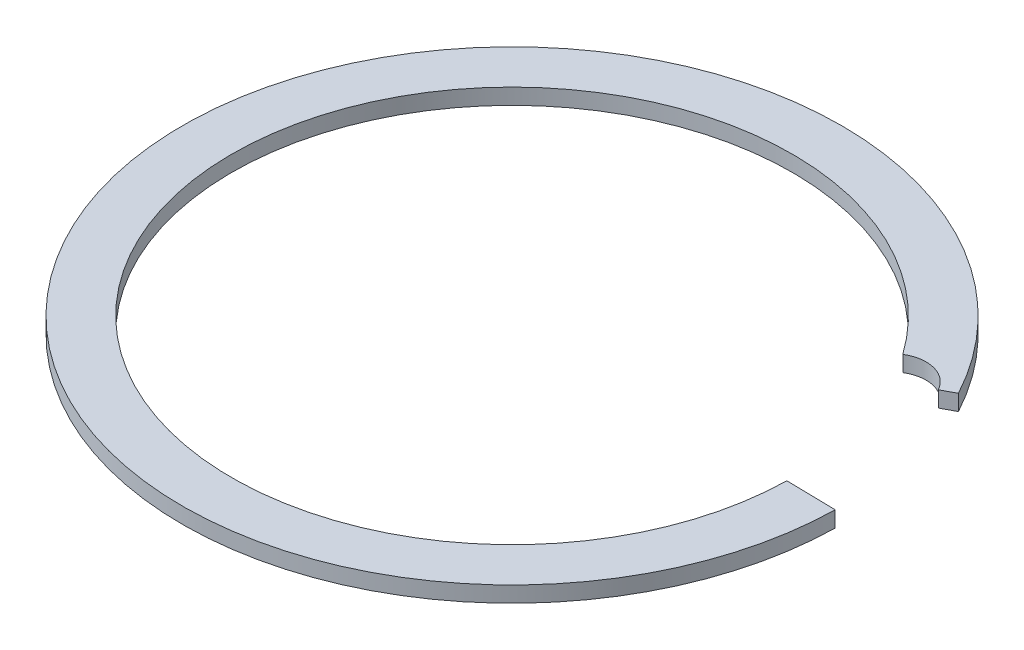
ISO-10303-21;
HEADER;
FILE_DESCRIPTION(('STEP AP214'),'2;1');
FILE_NAME('part.step','',(''),(''),'','','');
FILE_SCHEMA(('AUTOMOTIVE_DESIGN { 1 0 10303 214 1 1 1 1 }'));
ENDSEC;
DATA;
#1=APPLICATION_CONTEXT('core data for automotive mechanical design processes');
#2=APPLICATION_PROTOCOL_DEFINITION('international standard','automotive_design',2000,#1);
#3=PRODUCT_CONTEXT('',#1,'mechanical');
#4=PRODUCT('Part','Part','',(#3));
#5=PRODUCT_RELATED_PRODUCT_CATEGORY('part','',(#4));
#6=PRODUCT_DEFINITION_FORMATION('','',#4);
#7=PRODUCT_DEFINITION_CONTEXT('part definition',#1,'design');
#8=PRODUCT_DEFINITION('design','',#6,#7);
#9=PRODUCT_DEFINITION_SHAPE('','',#8);
#10=(LENGTH_UNIT() NAMED_UNIT(*) SI_UNIT(.MILLI.,.METRE.));
#11=(NAMED_UNIT(*) PLANE_ANGLE_UNIT() SI_UNIT($,.RADIAN.));
#12=(NAMED_UNIT(*) SI_UNIT($,.STERADIAN.) SOLID_ANGLE_UNIT());
#13=UNCERTAINTY_MEASURE_WITH_UNIT(LENGTH_MEASURE(1.E-05),#10,'distance_accuracy_value','');
#14=(GEOMETRIC_REPRESENTATION_CONTEXT(3) GLOBAL_UNCERTAINTY_ASSIGNED_CONTEXT((#13)) GLOBAL_UNIT_ASSIGNED_CONTEXT((#10,
#11,#12)) REPRESENTATION_CONTEXT('',''));
#15=CARTESIAN_POINT('',(0.,0.,0.));
#16=DIRECTION('',(0.,0.,1.));
#17=DIRECTION('',(1.,0.,0.));
#18=AXIS2_PLACEMENT_3D('',#15,#16,#17);
#19=CARTESIAN_POINT('',(0.,0.53,0.));
#20=DIRECTION('',(0.,-1.,0.));
#21=DIRECTION('',(0.,0.,-1.));
#22=AXIS2_PLACEMENT_3D('',#19,#20,#21);
#23=CYLINDRICAL_SURFACE('',#22,9.38);
#24=CARTESIAN_POINT('',(0.,0.,0.));
#25=DIRECTION('',(0.,1.,0.));
#26=DIRECTION('',(1.,0.,0.));
#27=AXIS2_PLACEMENT_3D('',#24,#25,#26);
#28=CIRCLE('',#27,9.38);
#29=CARTESIAN_POINT('',(7.65297959665888,0.,-5.42367986639356));
#30=VERTEX_POINT('',#29);
#31=CARTESIAN_POINT('',(9.37825586378028,0.,0.180878283579983));
#32=VERTEX_POINT('',#31);
#33=EDGE_CURVE('E110',#30,#32,#28,.T.);
#34=ORIENTED_EDGE('',*,*,#33,.F.);
#35=DIRECTION('',(0.,-1.,0.));
#36=VECTOR('',#35,1.);
#37=CARTESIAN_POINT('',(7.65297959665887,0.265,-5.42367986639357));
#38=LINE('',#37,#36);
#39=CARTESIAN_POINT('',(7.65297959665887,0.53,-5.42367986639357));
#40=VERTEX_POINT('',#39);
#41=EDGE_CURVE('E48',#30,#40,#38,.F.);
#42=ORIENTED_EDGE('',*,*,#41,.T.);
#43=CARTESIAN_POINT('',(0.,0.53,0.));
#44=DIRECTION('',(0.,1.,0.));
#45=DIRECTION('',(1.,0.,0.));
#46=AXIS2_PLACEMENT_3D('',#43,#44,#45);
#47=CIRCLE('',#46,9.38);
#48=CARTESIAN_POINT('',(9.37825586378028,0.53,0.180878283579983));
#49=VERTEX_POINT('',#48);
#50=EDGE_CURVE('E96',#40,#49,#47,.T.);
#51=ORIENTED_EDGE('',*,*,#50,.T.);
#52=DIRECTION('',(0.,-1.,0.));
#53=VECTOR('',#52,1.);
#54=CARTESIAN_POINT('',(9.37825586378028,0.53,0.180878283579983));
#55=LINE('',#54,#53);
#56=EDGE_CURVE('E41',#49,#32,#55,.T.);
#57=ORIENTED_EDGE('',*,*,#56,.T.);
#58=EDGE_LOOP('',(#34,#42,#51,#57));
#59=FACE_BOUND('',#58,.T.);
#60=ADVANCED_FACE('F33',(#59),#23,.F.);
#61=CARTESIAN_POINT('',(9.71285217470561,0.53,-5.2269879120117));
#62=DIRECTION('',(0.473888296646574,0.,0.880584965975123));
#63=DIRECTION('',(0.880584965975123,0.,-0.473888296646574));
#64=AXIS2_PLACEMENT_3D('',#61,#62,#63);
#65=PLANE('',#64);
#66=DIRECTION('',(-0.880584965975123,0.,0.473888296646574));
#67=VECTOR('',#66,1.);
#68=CARTESIAN_POINT('',(9.71285217470561,0.53,-5.2269879120117));
#69=LINE('',#68,#67);
#70=CARTESIAN_POINT('',(9.71285217470561,0.53,-5.2269879120117));
#71=VERTEX_POINT('',#70);
#72=CARTESIAN_POINT('',(9.27390245683206,0.53,-4.99076637501755));
#73=VERTEX_POINT('',#72);
#74=EDGE_CURVE('E95',#71,#73,#69,.T.);
#75=ORIENTED_EDGE('',*,*,#74,.T.);
#76=DIRECTION('',(0.,-1.,0.));
#77=VECTOR('',#76,1.);
#78=CARTESIAN_POINT('',(9.27390245683206,0.53,-4.99076637501755));
#79=LINE('',#78,#77);
#80=CARTESIAN_POINT('',(9.27390245683206,0.,-4.99076637501755));
#81=VERTEX_POINT('',#80);
#82=EDGE_CURVE('E86',#73,#81,#79,.T.);
#83=ORIENTED_EDGE('',*,*,#82,.T.);
#84=DIRECTION('',(-0.880584965975123,0.,0.473888296646574));
#85=VECTOR('',#84,1.);
#86=CARTESIAN_POINT('',(9.71285217470561,0.,-5.2269879120117));
#87=LINE('',#86,#85);
#88=CARTESIAN_POINT('',(9.71285217470561,0.,-5.2269879120117));
#89=VERTEX_POINT('',#88);
#90=EDGE_CURVE('E112',#89,#81,#87,.T.);
#91=ORIENTED_EDGE('',*,*,#90,.F.);
#92=DIRECTION('',(0.,-1.,0.));
#93=VECTOR('',#92,1.);
#94=CARTESIAN_POINT('',(9.71285217470561,0.53,-5.2269879120117));
#95=LINE('',#94,#93);
#96=EDGE_CURVE('E57',#71,#89,#95,.T.);
#97=ORIENTED_EDGE('',*,*,#96,.F.);
#98=EDGE_LOOP('',(#75,#83,#91,#97));
#99=FACE_BOUND('',#98,.T.);
#100=ADVANCED_FACE('F98',(#99),#65,.T.);
#101=CARTESIAN_POINT('',(0.,0.53,0.));
#102=DIRECTION('',(0.,-1.,0.));
#103=DIRECTION('',(0.,0.,-1.));
#104=AXIS2_PLACEMENT_3D('',#101,#102,#103);
#105=CYLINDRICAL_SURFACE('',#104,11.03);
#106=CARTESIAN_POINT('',(0.,0.,0.));
#107=DIRECTION('',(0.,1.,0.));
#108=DIRECTION('',(0.,0.,1.));
#109=AXIS2_PLACEMENT_3D('',#106,#107,#108);
#110=CIRCLE('',#109,11.03);
#111=CARTESIAN_POINT('',(11.0279490594346,0.,0.212695892098847));
#112=VERTEX_POINT('',#111);
#113=EDGE_CURVE('E105',#89,#112,#110,.T.);
#114=ORIENTED_EDGE('',*,*,#113,.T.);
#115=DIRECTION('',(0.,-1.,0.));
#116=VECTOR('',#115,1.);
#117=CARTESIAN_POINT('',(11.0279490594346,0.53,0.212695892098847));
#118=LINE('',#117,#116);
#119=CARTESIAN_POINT('',(11.0279490594346,0.53,0.212695892098847));
#120=VERTEX_POINT('',#119);
#121=EDGE_CURVE('E11',#120,#112,#118,.T.);
#122=ORIENTED_EDGE('',*,*,#121,.F.);
#123=CARTESIAN_POINT('',(0.,0.53,0.));
#124=DIRECTION('',(0.,1.,0.));
#125=DIRECTION('',(0.,0.,1.));
#126=AXIS2_PLACEMENT_3D('',#123,#124,#125);
#127=CIRCLE('',#126,11.03);
#128=EDGE_CURVE('E77',#71,#120,#127,.T.);
#129=ORIENTED_EDGE('',*,*,#128,.F.);
#130=ORIENTED_EDGE('',*,*,#96,.T.);
#131=EDGE_LOOP('',(#114,#122,#129,#130));
#132=FACE_BOUND('',#131,.T.);
#133=ADVANCED_FACE('F35',(#132),#105,.T.);
#134=CARTESIAN_POINT('',(9.37825586378028,0.53,0.180878283579983));
#135=DIRECTION('',(0.0192833991023423,0.,-0.999814057972311));
#136=DIRECTION('',(-0.999814057972311,0.,-0.0192833991023423));
#137=AXIS2_PLACEMENT_3D('',#134,#135,#136);
#138=PLANE('',#137);
#139=DIRECTION('',(0.999814057972311,0.,0.0192833991023423));
#140=VECTOR('',#139,1.);
#141=CARTESIAN_POINT('',(9.37825586378028,0.,0.180878283579983));
#142=LINE('',#141,#140);
#143=EDGE_CURVE('E107',#32,#112,#142,.T.);
#144=ORIENTED_EDGE('',*,*,#143,.F.);
#145=ORIENTED_EDGE('',*,*,#56,.F.);
#146=DIRECTION('',(0.999814057972311,0.,0.0192833991023423));
#147=VECTOR('',#146,1.);
#148=CARTESIAN_POINT('',(9.37825586378028,0.53,0.180878283579983));
#149=LINE('',#148,#147);
#150=EDGE_CURVE('E101',#49,#120,#149,.T.);
#151=ORIENTED_EDGE('',*,*,#150,.T.);
#152=ORIENTED_EDGE('',*,*,#121,.T.);
#153=EDGE_LOOP('',(#144,#145,#151,#152));
#154=FACE_BOUND('',#153,.T.);
#155=ADVANCED_FACE('F120',(#154),#138,.T.);
#156=CARTESIAN_POINT('',(0.,0.53,0.));
#157=DIRECTION('',(0.,1.,0.));
#158=DIRECTION('',(1.,0.,0.));
#159=AXIS2_PLACEMENT_3D('',#156,#157,#158);
#160=PLANE('',#159);
#161=ORIENTED_EDGE('',*,*,#50,.F.);
#162=CARTESIAN_POINT('',(8.25988698084666,0.53,-4.44507222254486));
#163=DIRECTION('',(0.,1.,0.));
#164=DIRECTION('',(0.,0.,1.));
#165=AXIS2_PLACEMENT_3D('',#162,#163,#164);
#166=CIRCLE('',#165,1.15152485582414);
#167=EDGE_CURVE('E89',#73,#40,#166,.T.);
#168=ORIENTED_EDGE('',*,*,#167,.F.);
#169=ORIENTED_EDGE('',*,*,#74,.F.);
#170=ORIENTED_EDGE('',*,*,#128,.T.);
#171=ORIENTED_EDGE('',*,*,#150,.F.);
#172=EDGE_LOOP('',(#161,#168,#169,#170,#171));
#173=FACE_BOUND('',#172,.T.);
#174=ADVANCED_FACE('F94',(#173),#160,.T.);
#175=CARTESIAN_POINT('',(0.,0.,0.));
#176=DIRECTION('',(0.,1.,0.));
#177=DIRECTION('',(1.,0.,0.));
#178=AXIS2_PLACEMENT_3D('',#175,#176,#177);
#179=PLANE('',#178);
#180=CARTESIAN_POINT('',(8.25988698084666,0.,-4.44507222254486));
#181=DIRECTION('',(0.,1.,0.));
#182=DIRECTION('',(0.,0.,1.));
#183=AXIS2_PLACEMENT_3D('',#180,#181,#182);
#184=CIRCLE('',#183,1.15152485582414);
#185=EDGE_CURVE('E90',#81,#30,#184,.T.);
#186=ORIENTED_EDGE('',*,*,#185,.T.);
#187=ORIENTED_EDGE('',*,*,#33,.T.);
#188=ORIENTED_EDGE('',*,*,#143,.T.);
#189=ORIENTED_EDGE('',*,*,#113,.F.);
#190=ORIENTED_EDGE('',*,*,#90,.T.);
#191=EDGE_LOOP('',(#186,#187,#188,#189,#190));
#192=FACE_BOUND('',#191,.T.);
#193=ADVANCED_FACE('F122',(#192),#179,.F.);
#194=CARTESIAN_POINT('',(8.25988698084666,0.53,-4.44507222254486));
#195=DIRECTION('',(0.,-1.,0.));
#196=DIRECTION('',(0.,0.,-1.));
#197=AXIS2_PLACEMENT_3D('',#194,#195,#196);
#198=CYLINDRICAL_SURFACE('',#197,1.15152485582414);
#199=ORIENTED_EDGE('',*,*,#185,.F.);
#200=ORIENTED_EDGE('',*,*,#82,.F.);
#201=ORIENTED_EDGE('',*,*,#167,.T.);
#202=ORIENTED_EDGE('',*,*,#41,.F.);
#203=EDGE_LOOP('',(#199,#200,#201,#202));
#204=FACE_BOUND('',#203,.T.);
#205=ADVANCED_FACE('F88',(#204),#198,.F.);
#206=CLOSED_SHELL('',(#60,#100,#133,#155,#174,#193,#205));
#207=MANIFOLD_SOLID_BREP('B2',#206);
#208=ADVANCED_BREP_SHAPE_REPRESENTATION('',(#18,#207),#14);
#209=SHAPE_DEFINITION_REPRESENTATION(#9,#208);
ENDSEC;
END-ISO-10303-21;
